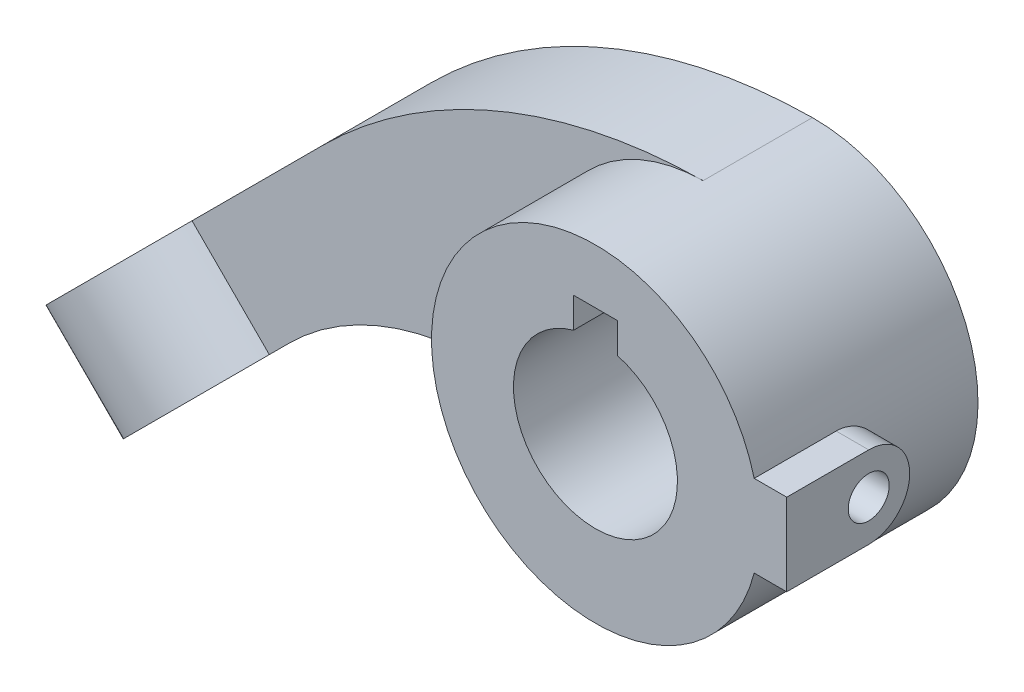
ISO-10303-21;
HEADER;
FILE_DESCRIPTION(('STEP AP214'),'2;1');
FILE_NAME('part.step','',(''),(''),'','','');
FILE_SCHEMA(('AUTOMOTIVE_DESIGN { 1 0 10303 214 1 1 1 1 }'));
ENDSEC;
DATA;
#1=APPLICATION_CONTEXT('core data for automotive mechanical design processes');
#2=APPLICATION_PROTOCOL_DEFINITION('international standard','automotive_design',2000,#1);
#3=PRODUCT_CONTEXT('',#1,'mechanical');
#4=PRODUCT('Part','Part','',(#3));
#5=PRODUCT_RELATED_PRODUCT_CATEGORY('part','',(#4));
#6=PRODUCT_DEFINITION_FORMATION('','',#4);
#7=PRODUCT_DEFINITION_CONTEXT('part definition',#1,'design');
#8=PRODUCT_DEFINITION('design','',#6,#7);
#9=PRODUCT_DEFINITION_SHAPE('','',#8);
#10=(LENGTH_UNIT() NAMED_UNIT(*) SI_UNIT(.MILLI.,.METRE.));
#11=(NAMED_UNIT(*) PLANE_ANGLE_UNIT() SI_UNIT($,.RADIAN.));
#12=(NAMED_UNIT(*) SI_UNIT($,.STERADIAN.) SOLID_ANGLE_UNIT());
#13=UNCERTAINTY_MEASURE_WITH_UNIT(LENGTH_MEASURE(1.E-05),#10,'distance_accuracy_value','');
#14=(GEOMETRIC_REPRESENTATION_CONTEXT(3) GLOBAL_UNCERTAINTY_ASSIGNED_CONTEXT((#13)) GLOBAL_UNIT_ASSIGNED_CONTEXT((#10,
#11,#12)) REPRESENTATION_CONTEXT('',''));
#15=CARTESIAN_POINT('',(0.,0.,0.));
#16=DIRECTION('',(0.,0.,1.));
#17=DIRECTION('',(1.,0.,0.));
#18=AXIS2_PLACEMENT_3D('',#15,#16,#17);
#19=CARTESIAN_POINT('',(0.,0.,40.));
#20=DIRECTION('',(0.,0.,-1.));
#21=DIRECTION('',(-1.,0.,0.));
#22=AXIS2_PLACEMENT_3D('',#19,#20,#21);
#23=CYLINDRICAL_SURFACE('',#22,15.);
#24=CARTESIAN_POINT('',(15.,0.,21.25));
#25=CARTESIAN_POINT('',(14.9999964967003,0.207190221674325,21.2500058143454));
#26=CARTESIAN_POINT('',(14.9956644532957,0.414445394576905,21.2672288769345));
#27=CARTESIAN_POINT('',(14.9788028457474,0.823015809426329,21.3355628782675));
#28=CARTESIAN_POINT('',(14.9662686354994,1.02432761717685,21.3866930238446));
#29=CARTESIAN_POINT('',(14.9343906583008,1.41505218045644,21.5210981336552));
#30=CARTESIAN_POINT('',(14.9150550710515,1.604478908575,21.6043344967882));
#31=CARTESIAN_POINT('',(14.8716335951905,1.96668032976107,21.8004534751121));
#32=CARTESIAN_POINT('',(14.8475475463539,2.13945446087191,21.9133370902974));
#33=CARTESIAN_POINT('',(14.7966853397923,2.46700481825229,22.1680019741355));
#34=CARTESIAN_POINT('',(14.7698676787032,2.62138922515264,22.3102789373977));
#35=CARTESIAN_POINT('',(14.7168405029484,2.90437231800829,22.6186305122726));
#36=CARTESIAN_POINT('',(14.6906310572467,3.03296809237297,22.7847078073673));
#37=CARTESIAN_POINT('',(14.6413693924542,3.26256635699743,23.1389880668425));
#38=CARTESIAN_POINT('',(14.6183698616203,3.36313053981285,23.3274830770218));
#39=CARTESIAN_POINT('',(14.5787373704504,3.53099227137686,23.7193710291501));
#40=CARTESIAN_POINT('',(14.5621033923605,3.59829513860035,23.92276158333));
#41=CARTESIAN_POINT('',(14.5375119174081,3.69638709201191,24.3343587455042));
#42=CARTESIAN_POINT('',(14.5293872749253,3.72788067083013,24.542387240095));
#43=CARTESIAN_POINT('',(14.5222340614898,3.75565443766602,24.9609214224984));
#44=CARTESIAN_POINT('',(14.5232040106982,3.75194035454527,25.1714267017303));
#45=CARTESIAN_POINT('',(14.5339801379204,3.70996631159926,25.5835395193634));
#46=CARTESIAN_POINT('',(14.5435715751823,3.67254585047658,25.7852390536633));
#47=CARTESIAN_POINT('',(14.5701677417767,3.56556046725748,26.1794026272776));
#48=CARTESIAN_POINT('',(14.587172999231,3.49599325517348,26.3718660075723));
#49=CARTESIAN_POINT('',(14.6268778476415,3.32597369484296,26.7443450406303));
#50=CARTESIAN_POINT('',(14.6496331867454,3.22521666808229,26.9242154294739));
#51=CARTESIAN_POINT('',(14.6982427711498,2.99589069003736,27.264796774392));
#52=CARTESIAN_POINT('',(14.7240975583657,2.86731687202209,27.4255043701681));
#53=CARTESIAN_POINT('',(14.7768970134973,2.58165856170305,27.728009039236));
#54=CARTESIAN_POINT('',(14.80385173695,2.42386564541465,27.8691362251534));
#55=CARTESIAN_POINT('',(14.8551491394689,2.08652979375924,28.1230531061598));
#56=CARTESIAN_POINT('',(14.8794917387352,1.90698619426985,28.2358419356589));
#57=CARTESIAN_POINT('',(14.9229433023548,1.53028972170348,28.430126465561));
#58=CARTESIAN_POINT('',(14.9420340031932,1.33307848302155,28.5115133506361));
#59=CARTESIAN_POINT('',(14.9726979247854,0.927190020357202,28.6397932642739));
#60=CARTESIAN_POINT('',(14.984272583482,0.718514997876207,28.6866928910453));
#61=CARTESIAN_POINT('',(14.9983874817844,0.301349925975062,28.7436439138971));
#62=CARTESIAN_POINT('',(15.0011513377069,0.0929917999705201,28.7546075651883));
#63=CARTESIAN_POINT('',(14.9979701203613,-0.322582187003776,28.7418774948613));
#64=CARTESIAN_POINT('',(14.9920258310463,-0.529798149111495,28.7181868930022));
#65=CARTESIAN_POINT('',(14.9722395281838,-0.934035671941231,28.6375727290216));
#66=CARTESIAN_POINT('',(14.9585158546447,-1.13116279742188,28.5811468413076));
#67=CARTESIAN_POINT('',(14.924717665854,-1.51314323113129,28.4372322899289));
#68=CARTESIAN_POINT('',(14.9046425092496,-1.69799529758163,28.3497404892169));
#69=CARTESIAN_POINT('',(14.8598326981554,-2.05380783607458,28.1444096778133));
#70=CARTESIAN_POINT('',(14.8350216841645,-2.22446360458942,28.0260597190086));
#71=CARTESIAN_POINT('',(14.7836127296943,-2.54381653410828,27.7630252280071));
#72=CARTESIAN_POINT('',(14.7570144813255,-2.69250989743314,27.6183361509559));
#73=CARTESIAN_POINT('',(14.7042239239856,-2.9674764201812,27.3024950978907));
#74=CARTESIAN_POINT('',(14.678057604555,-3.09310966905272,27.130780742501));
#75=CARTESIAN_POINT('',(14.629821959558,-3.31377689753411,26.7681684138287));
#76=CARTESIAN_POINT('',(14.6077524521502,-3.40881223540368,26.5772712925744));
#77=CARTESIAN_POINT('',(14.5704523678941,-3.5648785515182,26.1827356939839));
#78=CARTESIAN_POINT('',(14.5551813805407,-3.62611099160838,25.9791809292174));
#79=CARTESIAN_POINT('',(14.5331686006952,-3.71336414985793,25.5642259053637));
#80=CARTESIAN_POINT('',(14.5264249429205,-3.73939256869197,25.3528273724535));
#81=CARTESIAN_POINT('',(14.5223725301746,-3.75509647583946,24.9346974403302));
#82=CARTESIAN_POINT('',(14.5247983170337,-3.74579474444337,24.7280064121408));
#83=CARTESIAN_POINT('',(14.5381977237985,-3.6934431957724,24.3192402782958));
#84=CARTESIAN_POINT('',(14.5491711719226,-3.6503940567158,24.1171650799604));
#85=CARTESIAN_POINT('',(14.5782815174391,-3.53232829861052,23.72447885235));
#86=CARTESIAN_POINT('',(14.5963753810072,-3.45750351170189,23.5338067369031));
#87=CARTESIAN_POINT('',(14.6376938930212,-3.27816228401173,23.1675865432122));
#88=CARTESIAN_POINT('',(14.6609192529923,-3.17364172508522,22.9920405670317));
#89=CARTESIAN_POINT('',(14.7106408566155,-2.9346693715931,22.656113427496));
#90=CARTESIAN_POINT('',(14.7372066208013,-2.79950790728071,22.4962473164404));
#91=CARTESIAN_POINT('',(14.7902006811497,-2.50447342797427,22.2011323880112));
#92=CARTESIAN_POINT('',(14.8166289431745,-2.34459455315285,22.0658894247175));
#93=CARTESIAN_POINT('',(14.8669413911936,-2.0011689667565,21.8214717285886));
#94=CARTESIAN_POINT('',(14.8907708341472,-1.81724605579097,21.7128134658211));
#95=CARTESIAN_POINT('',(14.9326231243774,-1.43316514877618,21.5281313426487));
#96=CARTESIAN_POINT('',(14.9506501299944,-1.23301890859185,21.4520840983787));
#97=CARTESIAN_POINT('',(14.9762014891386,-0.86102563310868,21.3460704241759));
#98=CARTESIAN_POINT('',(14.9850646263173,-0.690950427270172,21.3101218923664));
#99=CARTESIAN_POINT('',(14.9969651307987,-0.347265178840709,21.2620851409451));
#100=CARTESIAN_POINT('',(15.0000029362724,-0.173655403106543,21.2499951267367));
#101=CARTESIAN_POINT('',(15.,0.,21.25));
#102=B_SPLINE_CURVE_WITH_KNOTS('',3,(#24,#25,#26,#27,#28,#29,#30,#31,#32,#33,#34,#35,#36,#37,
#38,#39,#40,#41,#42,#43,#44,#45,#46,#47,#48,#49,#50,#51,#52,#53,#54,#55,#56,#57,#58,#59,#60,#61,
#62,#63,#64,#65,#66,#67,#68,#69,#70,#71,#72,#73,#74,#75,#76,#77,#78,#79,#80,#81,#82,#83,#84,#85,
#86,#87,#88,#89,#90,#91,#92,#93,#94,#95,#96,#97,#98,#99,#100,#101),.UNSPECIFIED.,.T.,.F.,(4,2,2,
2,2,2,2,2,2,2,2,2,2,2,2,2,2,2,2,2,2,2,2,2,2,2,2,2,2,2,2,2,2,2,2,2,2,2,4),(0.,0.620934281179724,
1.24222059440975,1.86276225571526,2.48332485042332,3.11536088592847,3.74746823950154,
4.38896618864517,5.03036152923421,5.65890737752674,6.28735095290044,6.90056242525847,
7.51381758673398,8.13326319693,8.75281727098709,9.3900375243085,10.0272772390392,
10.6667057253109,11.3060118422991,11.9289577238149,12.5518475279016,13.165506862934,
13.7792281831403,14.4038396892168,15.0285590752835,15.6686127301949,16.3086379688207,
16.9448063654645,17.5808355814571,18.1985945101388,18.8163410240997,19.430410014185,
20.0445642036213,20.6747394104466,21.3050642444592,21.9468046376885,22.5880840957326,
23.1085560737525,23.6289889012748),.UNSPECIFIED.);
#103=CARTESIAN_POINT('',(15.,0.,21.25));
#104=VERTEX_POINT('',#103);
#105=EDGE_CURVE('E169',#104,#104,#102,.T.);
#106=ORIENTED_EDGE('',*,*,#105,.T.);
#107=EDGE_LOOP('',(#106));
#108=FACE_BOUND('',#107,.T.);
#109=CARTESIAN_POINT('',(0.,0.,0.));
#110=DIRECTION('',(0.,0.,1.));
#111=DIRECTION('',(1.,0.,0.));
#112=AXIS2_PLACEMENT_3D('',#109,#110,#111);
#113=CIRCLE('',#112,15.);
#114=CARTESIAN_POINT('',(-4.,14.456832294801,0.));
#115=VERTEX_POINT('',#114);
#116=CARTESIAN_POINT('',(4.,14.456832294801,0.));
#117=VERTEX_POINT('',#116);
#118=EDGE_CURVE('E226',#115,#117,#113,.T.);
#119=ORIENTED_EDGE('',*,*,#118,.F.);
#120=DIRECTION('',(0.,0.,-1.));
#121=VECTOR('',#120,1.);
#122=CARTESIAN_POINT('',(-4.,14.456832294801,40.));
#123=LINE('',#122,#121);
#124=CARTESIAN_POINT('',(-4.,14.456832294801,40.));
#125=VERTEX_POINT('',#124);
#126=EDGE_CURVE('E64',#125,#115,#123,.T.);
#127=ORIENTED_EDGE('',*,*,#126,.F.);
#128=CARTESIAN_POINT('',(0.,0.,40.));
#129=DIRECTION('',(0.,0.,1.));
#130=DIRECTION('',(1.,0.,0.));
#131=AXIS2_PLACEMENT_3D('',#128,#129,#130);
#132=CIRCLE('',#131,15.);
#133=CARTESIAN_POINT('',(4.,14.456832294801,40.));
#134=VERTEX_POINT('',#133);
#135=EDGE_CURVE('E256',#125,#134,#132,.T.);
#136=ORIENTED_EDGE('',*,*,#135,.T.);
#137=DIRECTION('',(0.,0.,-1.));
#138=VECTOR('',#137,1.);
#139=CARTESIAN_POINT('',(4.,14.456832294801,40.));
#140=LINE('',#139,#138);
#141=EDGE_CURVE('E231',#134,#117,#140,.T.);
#142=ORIENTED_EDGE('',*,*,#141,.T.);
#143=EDGE_LOOP('',(#119,#127,#136,#142));
#144=FACE_BOUND('',#143,.T.);
#145=ADVANCED_FACE('F56',(#108,#144),#23,.F.);
#146=CARTESIAN_POINT('',(-4.,0.,40.));
#147=DIRECTION('',(1.,0.,0.));
#148=DIRECTION('',(0.,0.,-1.));
#149=AXIS2_PLACEMENT_3D('',#146,#147,#148);
#150=PLANE('',#149);
#151=DIRECTION('',(0.,-1.,0.));
#152=VECTOR('',#151,1.);
#153=CARTESIAN_POINT('',(-4.,0.,0.));
#154=LINE('',#153,#152);
#155=CARTESIAN_POINT('',(-4.,20.,0.));
#156=VERTEX_POINT('',#155);
#157=EDGE_CURVE('E236',#156,#115,#154,.T.);
#158=ORIENTED_EDGE('',*,*,#157,.F.);
#159=DIRECTION('',(0.,0.,-1.));
#160=VECTOR('',#159,1.);
#161=CARTESIAN_POINT('',(-4.,20.,40.));
#162=LINE('',#161,#160);
#163=CARTESIAN_POINT('',(-4.,20.,40.));
#164=VERTEX_POINT('',#163);
#165=EDGE_CURVE('E263',#164,#156,#162,.T.);
#166=ORIENTED_EDGE('',*,*,#165,.F.);
#167=DIRECTION('',(0.,-1.,0.));
#168=VECTOR('',#167,1.);
#169=CARTESIAN_POINT('',(-4.,0.,40.));
#170=LINE('',#169,#168);
#171=EDGE_CURVE('E268',#164,#125,#170,.T.);
#172=ORIENTED_EDGE('',*,*,#171,.T.);
#173=ORIENTED_EDGE('',*,*,#126,.T.);
#174=EDGE_LOOP('',(#158,#166,#172,#173));
#175=FACE_BOUND('',#174,.T.);
#176=ADVANCED_FACE('F214',(#175),#150,.T.);
#177=CARTESIAN_POINT('',(0.,20.,40.));
#178=DIRECTION('',(0.,1.,0.));
#179=DIRECTION('',(0.,0.,1.));
#180=AXIS2_PLACEMENT_3D('',#177,#178,#179);
#181=PLANE('',#180);
#182=DIRECTION('',(1.,0.,0.));
#183=VECTOR('',#182,1.);
#184=CARTESIAN_POINT('',(0.,20.,0.));
#185=LINE('',#184,#183);
#186=CARTESIAN_POINT('',(4.,20.,0.));
#187=VERTEX_POINT('',#186);
#188=EDGE_CURVE('E243',#156,#187,#185,.T.);
#189=ORIENTED_EDGE('',*,*,#188,.T.);
#190=DIRECTION('',(0.,0.,-1.));
#191=VECTOR('',#190,1.);
#192=CARTESIAN_POINT('',(4.,20.,40.));
#193=LINE('',#192,#191);
#194=CARTESIAN_POINT('',(4.,20.,40.));
#195=VERTEX_POINT('',#194);
#196=EDGE_CURVE('E259',#195,#187,#193,.T.);
#197=ORIENTED_EDGE('',*,*,#196,.F.);
#198=DIRECTION('',(1.,0.,0.));
#199=VECTOR('',#198,1.);
#200=CARTESIAN_POINT('',(0.,20.,40.));
#201=LINE('',#200,#199);
#202=EDGE_CURVE('E272',#164,#195,#201,.T.);
#203=ORIENTED_EDGE('',*,*,#202,.F.);
#204=ORIENTED_EDGE('',*,*,#165,.T.);
#205=EDGE_LOOP('',(#189,#197,#203,#204));
#206=FACE_BOUND('',#205,.T.);
#207=ADVANCED_FACE('F219',(#206),#181,.F.);
#208=CARTESIAN_POINT('',(4.,0.,40.));
#209=DIRECTION('',(1.,0.,0.));
#210=DIRECTION('',(0.,0.,-1.));
#211=AXIS2_PLACEMENT_3D('',#208,#209,#210);
#212=PLANE('',#211);
#213=DIRECTION('',(0.,-1.,0.));
#214=VECTOR('',#213,1.);
#215=CARTESIAN_POINT('',(4.,0.,0.));
#216=LINE('',#215,#214);
#217=EDGE_CURVE('E247',#187,#117,#216,.T.);
#218=ORIENTED_EDGE('',*,*,#217,.T.);
#219=ORIENTED_EDGE('',*,*,#141,.F.);
#220=DIRECTION('',(0.,-1.,0.));
#221=VECTOR('',#220,1.);
#222=CARTESIAN_POINT('',(4.,0.,40.));
#223=LINE('',#222,#221);
#224=EDGE_CURVE('E276',#195,#134,#223,.T.);
#225=ORIENTED_EDGE('',*,*,#224,.F.);
#226=ORIENTED_EDGE('',*,*,#196,.T.);
#227=EDGE_LOOP('',(#218,#219,#225,#226));
#228=FACE_BOUND('',#227,.T.);
#229=ADVANCED_FACE('F416',(#228),#212,.F.);
#230=CARTESIAN_POINT('',(0.,0.,40.));
#231=DIRECTION('',(0.,0.,-1.));
#232=DIRECTION('',(-1.,0.,0.));
#233=AXIS2_PLACEMENT_3D('',#230,#231,#232);
#234=CYLINDRICAL_SURFACE('',#233,30.);
#235=CARTESIAN_POINT('',(0.,0.,20.));
#236=DIRECTION('',(0.,0.,1.));
#237=DIRECTION('',(1.,0.,0.));
#238=AXIS2_PLACEMENT_3D('',#235,#236,#237);
#239=CIRCLE('',#238,30.);
#240=CARTESIAN_POINT('',(-0.306138389121367,29.998437947445,20.));
#241=VERTEX_POINT('',#240);
#242=CARTESIAN_POINT('',(-15.2362950475446,-25.8428967653428,20.));
#243=VERTEX_POINT('',#242);
#244=EDGE_CURVE('E339',#241,#243,#239,.T.);
#245=ORIENTED_EDGE('',*,*,#244,.T.);
#246=DIRECTION('',(0.,0.,-1.));
#247=VECTOR('',#246,1.);
#248=CARTESIAN_POINT('',(-15.2362950475446,-25.8428967653428,20.));
#249=LINE('',#248,#247);
#250=CARTESIAN_POINT('',(-15.2362950475446,-25.8428967653428,0.));
#251=VERTEX_POINT('',#250);
#252=EDGE_CURVE('E368',#243,#251,#249,.T.);
#253=ORIENTED_EDGE('',*,*,#252,.T.);
#254=CARTESIAN_POINT('',(0.,0.,0.));
#255=DIRECTION('',(0.,0.,1.));
#256=DIRECTION('',(1.,0.,0.));
#257=AXIS2_PLACEMENT_3D('',#254,#255,#256);
#258=CIRCLE('',#257,30.);
#259=CARTESIAN_POINT('',(-0.306138389121368,29.998437947445,0.));
#260=VERTEX_POINT('',#259);
#261=EDGE_CURVE('E253',#251,#260,#258,.T.);
#262=ORIENTED_EDGE('',*,*,#261,.T.);
#263=DIRECTION('',(0.,0.,-1.));
#264=VECTOR('',#263,1.);
#265=CARTESIAN_POINT('',(-0.306138389121368,29.998437947445,20.));
#266=LINE('',#265,#264);
#267=EDGE_CURVE('E364',#241,#260,#266,.T.);
#268=ORIENTED_EDGE('',*,*,#267,.F.);
#269=EDGE_LOOP('',(#245,#253,#262,#268));
#270=FACE_BOUND('',#269,.T.);
#271=CARTESIAN_POINT('',(0.,0.,40.));
#272=DIRECTION('',(0.,0.,1.));
#273=DIRECTION('',(1.,0.,0.));
#274=AXIS2_PLACEMENT_3D('',#271,#272,#273);
#275=CIRCLE('',#274,30.);
#276=CARTESIAN_POINT('',(29.0473750965556,7.5,40.));
#277=VERTEX_POINT('',#276);
#278=CARTESIAN_POINT('',(29.0473750965556,-7.5,40.));
#279=VERTEX_POINT('',#278);
#280=EDGE_CURVE('E181',#277,#279,#275,.T.);
#281=ORIENTED_EDGE('',*,*,#280,.F.);
#282=DIRECTION('',(0.,0.,-1.));
#283=VECTOR('',#282,1.);
#284=CARTESIAN_POINT('',(29.0473750965556,7.5,40.));
#285=LINE('',#284,#283);
#286=CARTESIAN_POINT('',(29.0473750965556,7.5,25.));
#287=VERTEX_POINT('',#286);
#288=EDGE_CURVE('E168',#287,#277,#285,.F.);
#289=ORIENTED_EDGE('',*,*,#288,.F.);
#290=CARTESIAN_POINT('',(29.0473750965556,-7.50000000000001,25.));
#291=CARTESIAN_POINT('',(29.0473511759174,-7.50002630108685,24.7925905745089));
#292=CARTESIAN_POINT('',(29.0495957628317,-7.49139743924831,24.5851895061186));
#293=CARTESIAN_POINT('',(29.058447840632,-7.45702283353465,24.1719382617645));
#294=CARTESIAN_POINT('',(29.0650545973684,-7.43127996992728,23.9660878307249));
#295=CARTESIAN_POINT('',(29.0824398226746,-7.36293825789864,23.5578049265756));
#296=CARTESIAN_POINT('',(29.0932100239986,-7.32037280993147,23.3553665044896));
#297=CARTESIAN_POINT('',(29.1185927891341,-7.21874728965258,22.9549198576045));
#298=CARTESIAN_POINT('',(29.1332054057858,-7.15968699050624,22.75691169377));
#299=CARTESIAN_POINT('',(29.1658394705169,-7.0255647350585,22.3667542852176));
#300=CARTESIAN_POINT('',(29.1838598476376,-6.95050780508764,22.1746032217567));
#301=CARTESIAN_POINT('',(29.2227994435593,-6.78492631419789,21.7973083945893));
#302=CARTESIAN_POINT('',(29.2437197368126,-6.69439601730774,21.6121672606625));
#303=CARTESIAN_POINT('',(29.2878606028261,-6.49856054845433,21.2501932797977));
#304=CARTESIAN_POINT('',(29.311080878195,-6.3932572859271,21.0733593630716));
#305=CARTESIAN_POINT('',(29.3591908844649,-6.16855831917554,20.7290319178891));
#306=CARTESIAN_POINT('',(29.3840812399093,-6.04915733014004,20.5615419270544));
#307=CARTESIAN_POINT('',(29.4353394276645,-5.79464941853499,20.2338800020483));
#308=CARTESIAN_POINT('',(29.4617265274239,-5.65928334041232,20.0739123247392));
#309=CARTESIAN_POINT('',(29.5148010113881,-5.37562488146013,19.7658317463563));
#310=CARTESIAN_POINT('',(29.5414884969906,-5.22732801437878,19.6177229941198));
#311=CARTESIAN_POINT('',(29.5944200556253,-4.91882000718369,19.3343957462764));
#312=CARTESIAN_POINT('',(29.6206641312248,-4.75860893607982,19.1991771760169));
#313=CARTESIAN_POINT('',(29.6719897661141,-4.42731474168454,18.9425427553436));
#314=CARTESIAN_POINT('',(29.6970713323942,-4.25623168378125,18.8211268219278));
#315=CARTESIAN_POINT('',(29.7457275538512,-3.90181138427035,18.5913260746709));
#316=CARTESIAN_POINT('',(29.7692758006224,-3.71833478777787,18.4831504346699));
#317=CARTESIAN_POINT('',(29.8137942642765,-3.34266809082169,18.2827179974889));
#318=CARTESIAN_POINT('',(29.8347654160678,-3.15048118508953,18.1904554224995));
#319=CARTESIAN_POINT('',(29.8735452916281,-2.75863317318168,18.0225083657783));
#320=CARTESIAN_POINT('',(29.8913533209924,-2.55897043744582,17.946827523409));
#321=CARTESIAN_POINT('',(29.9232806602041,-2.1537317289005,17.8127217006889));
#322=CARTESIAN_POINT('',(29.9374014885824,-1.94815822921592,17.7542896153402));
#323=CARTESIAN_POINT('',(29.9613124992079,-1.53667744877526,17.6561271734078));
#324=CARTESIAN_POINT('',(29.9711831556396,-1.33085796275945,17.6160482861094));
#325=CARTESIAN_POINT('',(29.986713323254,-0.916507124624956,17.5532622433413));
#326=CARTESIAN_POINT('',(29.9923744538182,-0.707976846777572,17.5305484075366));
#327=CARTESIAN_POINT('',(29.9993310272642,-0.289657091019968,17.5026641440293));
#328=CARTESIAN_POINT('',(30.0006261214674,-0.0798675138803536,17.4974951174824));
#329=CARTESIAN_POINT('',(29.9988126242559,0.339386681265645,17.5047500571515));
#330=CARTESIAN_POINT('',(29.9957040875121,0.548851303274017,17.5171738049536));
#331=CARTESIAN_POINT('',(29.9852905046834,0.961217992261124,17.5590293371298));
#332=CARTESIAN_POINT('',(29.9780810549947,1.16416193681367,17.5880737665741));
#333=CARTESIAN_POINT('',(29.9597313457171,1.56688998921898,17.6626430175519));
#334=CARTESIAN_POINT('',(29.9485897339773,1.76667298539533,17.7081735082806));
#335=CARTESIAN_POINT('',(29.9226804741066,2.16155863824409,17.815328423623));
#336=CARTESIAN_POINT('',(29.9079140483149,2.3566628483751,17.8769474234065));
#337=CARTESIAN_POINT('',(29.8751407694803,2.74101865026757,18.0158330296672));
#338=CARTESIAN_POINT('',(29.857132704997,2.9302680229131,18.0931054873931));
#339=CARTESIAN_POINT('',(29.8181867181723,3.30321049470373,18.2634437498359));
#340=CARTESIAN_POINT('',(29.7972247235465,3.48684111402383,18.3566408072565));
#341=CARTESIAN_POINT('',(29.7530411354479,3.84567797098895,18.5577119457031));
#342=CARTESIAN_POINT('',(29.7298187644511,4.02088127862292,18.6655910821877));
#343=CARTESIAN_POINT('',(29.6817351267761,4.36167586629251,18.8952475428427));
#344=CARTESIAN_POINT('',(29.6568739414194,4.5272676225082,19.0170241776084));
#345=CARTESIAN_POINT('',(29.6061655119558,4.84781396384561,19.2736698972185));
#346=CARTESIAN_POINT('',(29.580318248315,5.00276833807404,19.4085392415068));
#347=CARTESIAN_POINT('',(29.5276114452926,5.30512497019636,19.6943342324173));
#348=CARTESIAN_POINT('',(29.5007434803989,5.45220775675252,19.8455965078035));
#349=CARTESIAN_POINT('',(29.4474448513581,5.73309923074355,20.1599596557595));
#350=CARTESIAN_POINT('',(29.4210140453778,5.86691229674457,20.323056592317));
#351=CARTESIAN_POINT('',(29.3693097764637,6.1204904647594,20.6601715323998));
#352=CARTESIAN_POINT('',(29.3440370732009,6.24024642404371,20.8341965318355));
#353=CARTESIAN_POINT('',(29.2954027236369,6.46471718527408,21.1918521457009));
#354=CARTESIAN_POINT('',(29.2720403434714,6.56943777496164,21.375479026631));
#355=CARTESIAN_POINT('',(29.2277713463454,6.76368011488973,21.7522601497587));
#356=CARTESIAN_POINT('',(29.2068797977731,6.85310995400144,21.9454635793328));
#357=CARTESIAN_POINT('',(29.1683513607566,7.01528530975907,22.3389775838536));
#358=CARTESIAN_POINT('',(29.1507131740993,7.08803748424312,22.5392852857213));
#359=CARTESIAN_POINT('',(29.1192433218482,7.21623355454386,22.9454262300561));
#360=CARTESIAN_POINT('',(29.1054077164659,7.27169537266329,23.1512535091761));
#361=CARTESIAN_POINT('',(29.0819591937685,7.364913936369,23.5670292649706));
#362=CARTESIAN_POINT('',(29.072344298296,7.40267897662101,23.7769757627509));
#363=CARTESIAN_POINT('',(29.0591545349784,7.45426794156711,24.1558862095667));
#364=CARTESIAN_POINT('',(29.0547430946303,7.47142252804004,24.3243757189075));
#365=CARTESIAN_POINT('',(29.0488508241981,7.49428407329826,24.6619054436126));
#366=CARTESIAN_POINT('',(29.0473652527177,7.50000955325582,24.8309443226238));
#367=CARTESIAN_POINT('',(29.0473750965556,7.5,25.));
#368=B_SPLINE_CURVE_WITH_KNOTS('',3,(#290,#291,#292,#293,#294,#295,#296,#297,#298,#299,#300,
#301,#302,#303,#304,#305,#306,#307,#308,#309,#310,#311,#312,#313,#314,#315,#316,#317,#318,#319,
#320,#321,#322,#323,#324,#325,#326,#327,#328,#329,#330,#331,#332,#333,#334,#335,#336,#337,#338,
#339,#340,#341,#342,#343,#344,#345,#346,#347,#348,#349,#350,#351,#352,#353,#354,#355,#356,#357,
#358,#359,#360,#361,#362,#363,#364,#365,#366,#367),.UNSPECIFIED.,.F.,.F.,(4,2,2,2,2,2,2,2,2,2,2,
2,2,2,2,2,2,2,2,2,2,2,2,2,2,2,2,2,2,2,2,2,2,2,2,2,2,2,4),(0.,0.622023977548273,1.24394329563489,
1.8646339757276,2.48533319188245,3.10583766378365,3.72657265732951,4.34722749339996,
4.9681157373419,5.60101548914207,6.23413570173872,6.86725224744074,7.5003649857086,
8.14245446215661,8.78431031193528,9.42630689558009,10.0680386618956,10.6970193222736,
11.3257578918752,11.954546672337,12.583327646473,13.1980188731611,13.8129216797584,
14.4276174165124,15.042543351383,15.662806347413,16.2832834605873,16.9037298075039,
17.5241884516385,18.1615007474758,18.798602046807,19.4361154468078,20.0733827795184,
20.7143553882398,21.3550716689593,21.9951215904936,22.6348712130939,23.1427263018255,
23.6497577275344),.UNSPECIFIED.);
#369=CARTESIAN_POINT('',(29.0473750965556,-7.5,25.));
#370=VERTEX_POINT('',#369);
#371=EDGE_CURVE('E157',#370,#287,#368,.T.);
#372=ORIENTED_EDGE('',*,*,#371,.F.);
#373=DIRECTION('',(0.,0.,-1.));
#374=VECTOR('',#373,1.);
#375=CARTESIAN_POINT('',(29.0473750965556,-7.5,40.));
#376=LINE('',#375,#374);
#377=EDGE_CURVE('E178',#279,#370,#376,.T.);
#378=ORIENTED_EDGE('',*,*,#377,.F.);
#379=EDGE_LOOP('',(#281,#289,#372,#378));
#380=FACE_BOUND('',#379,.T.);
#381=ADVANCED_FACE('F180',(#270,#380),#234,.T.);
#382=CARTESIAN_POINT('',(0.,0.,40.));
#383=DIRECTION('',(0.,0.,1.));
#384=DIRECTION('',(1.,0.,0.));
#385=AXIS2_PLACEMENT_3D('',#382,#383,#384);
#386=PLANE('',#385);
#387=ORIENTED_EDGE('',*,*,#135,.F.);
#388=ORIENTED_EDGE('',*,*,#171,.F.);
#389=ORIENTED_EDGE('',*,*,#202,.T.);
#390=ORIENTED_EDGE('',*,*,#224,.T.);
#391=EDGE_LOOP('',(#387,#388,#389,#390));
#392=FACE_BOUND('',#391,.T.);
#393=ORIENTED_EDGE('',*,*,#280,.T.);
#394=DIRECTION('',(1.,0.,0.));
#395=VECTOR('',#394,1.);
#396=CARTESIAN_POINT('',(-120.210152801713,-7.5,40.));
#397=LINE('',#396,#395);
#398=CARTESIAN_POINT('',(35.,-7.5,40.));
#399=VERTEX_POINT('',#398);
#400=EDGE_CURVE('E284',#279,#399,#397,.T.);
#401=ORIENTED_EDGE('',*,*,#400,.T.);
#402=DIRECTION('',(0.,-1.,0.));
#403=VECTOR('',#402,1.);
#404=CARTESIAN_POINT('',(35.,7.5,40.));
#405=LINE('',#404,#403);
#406=CARTESIAN_POINT('',(35.,7.5,40.));
#407=VERTEX_POINT('',#406);
#408=EDGE_CURVE('E287',#407,#399,#405,.T.);
#409=ORIENTED_EDGE('',*,*,#408,.F.);
#410=DIRECTION('',(1.,0.,0.));
#411=VECTOR('',#410,1.);
#412=CARTESIAN_POINT('',(-120.210152801713,7.5,40.));
#413=LINE('',#412,#411);
#414=EDGE_CURVE('E71',#277,#407,#413,.T.);
#415=ORIENTED_EDGE('',*,*,#414,.F.);
#416=EDGE_LOOP('',(#393,#401,#409,#415));
#417=FACE_BOUND('',#416,.T.);
#418=ADVANCED_FACE('F283',(#392,#417),#386,.T.);
#419=CARTESIAN_POINT('',(0.,0.,0.));
#420=DIRECTION('',(0.,0.,1.));
#421=DIRECTION('',(1.,0.,0.));
#422=AXIS2_PLACEMENT_3D('',#419,#420,#421);
#423=PLANE('',#422);
#424=ORIENTED_EDGE('',*,*,#118,.T.);
#425=ORIENTED_EDGE('',*,*,#217,.F.);
#426=ORIENTED_EDGE('',*,*,#188,.F.);
#427=ORIENTED_EDGE('',*,*,#157,.T.);
#428=EDGE_LOOP('',(#424,#425,#426,#427));
#429=FACE_BOUND('',#428,.T.);
#430=DIRECTION('',(0.70710678118655,0.707106781186545,0.));
#431=VECTOR('',#430,1.);
#432=CARTESIAN_POINT('',(-21.2132034355961,21.2132034355963,0.));
#433=LINE('',#432,#431);
#434=CARTESIAN_POINT('',(-79.6764328403353,-37.2500259691425,0.));
#435=VERTEX_POINT('',#434);
#436=CARTESIAN_POINT('',(-75.985459186113,-33.5590523149202,0.));
#437=VERTEX_POINT('',#436);
#438=EDGE_CURVE('E330',#435,#437,#433,.T.);
#439=ORIENTED_EDGE('',*,*,#438,.F.);
#440=DIRECTION('',(0.707106781186545,-0.70710678118655,0.));
#441=VECTOR('',#440,1.);
#442=CARTESIAN_POINT('',(-93.8185684640662,-23.1078903454115,0.));
#443=LINE('',#442,#441);
#444=CARTESIAN_POINT('',(-93.8185684640662,-23.1078903454115,0.));
#445=VERTEX_POINT('',#444);
#446=EDGE_CURVE('E323',#435,#445,#443,.F.);
#447=ORIENTED_EDGE('',*,*,#446,.T.);
#448=DIRECTION('',(0.707106781186548,0.707106781186547,0.));
#449=VECTOR('',#448,1.);
#450=CARTESIAN_POINT('',(-35.3553390593273,35.3553390593274,0.));
#451=LINE('',#450,#449);
#452=CARTESIAN_POINT('',(-69.9963552107049,0.714322907949781,0.));
#453=VERTEX_POINT('',#452);
#454=EDGE_CURVE('E335',#445,#453,#451,.T.);
#455=ORIENTED_EDGE('',*,*,#454,.T.);
#456=CARTESIAN_POINT('',(0.714322907949858,-69.9963552107049,0.));
#457=DIRECTION('',(0.,0.,1.));
#458=DIRECTION('',(1.,0.,0.));
#459=AXIS2_PLACEMENT_3D('',#456,#457,#458);
#460=CIRCLE('',#459,100.);
#461=EDGE_CURVE('E355',#453,#260,#460,.F.);
#462=ORIENTED_EDGE('',*,*,#461,.T.);
#463=ORIENTED_EDGE('',*,*,#261,.F.);
#464=CARTESIAN_POINT('',(-40.6301201267856,-68.9143913742476,0.));
#465=DIRECTION('',(0.,0.,1.));
#466=DIRECTION('',(1.,0.,0.));
#467=AXIS2_PLACEMENT_3D('',#464,#465,#466);
#468=CIRCLE('',#467,50.);
#469=EDGE_CURVE('E351',#437,#251,#468,.F.);
#470=ORIENTED_EDGE('',*,*,#469,.F.);
#471=EDGE_LOOP('',(#439,#447,#455,#462,#463,#470));
#472=FACE_BOUND('',#471,.T.);
#473=ADVANCED_FACE('F241',(#429,#472),#423,.F.);
#474=CARTESIAN_POINT('',(-21.2132034355961,21.2132034355963,20.));
#475=DIRECTION('',(-0.707106781186545,0.70710678118655,0.));
#476=DIRECTION('',(-0.70710678118655,-0.707106781186545,0.));
#477=AXIS2_PLACEMENT_3D('',#474,#475,#476);
#478=PLANE('',#477);
#479=CARTESIAN_POINT('',(-91.9238815542512,-49.4974746830583,10.));
#480=DIRECTION('',(0.707106781186545,-0.70710678118655,0.));
#481=DIRECTION('',(0.70710678118655,0.707106781186545,0.));
#482=AXIS2_PLACEMENT_3D('',#479,#480,#481);
#483=CIRCLE('',#482,20.);
#484=CARTESIAN_POINT('',(-79.6764328403353,-37.2500259691425,20.));
#485=VERTEX_POINT('',#484);
#486=EDGE_CURVE('E315',#485,#435,#483,.T.);
#487=ORIENTED_EDGE('',*,*,#486,.T.);
#488=ORIENTED_EDGE('',*,*,#438,.T.);
#489=DIRECTION('',(0.,0.,-1.));
#490=VECTOR('',#489,1.);
#491=CARTESIAN_POINT('',(-75.985459186113,-33.5590523149202,20.));
#492=LINE('',#491,#490);
#493=CARTESIAN_POINT('',(-75.985459186113,-33.5590523149202,20.));
#494=VERTEX_POINT('',#493);
#495=EDGE_CURVE('E237',#494,#437,#492,.T.);
#496=ORIENTED_EDGE('',*,*,#495,.F.);
#497=DIRECTION('',(0.70710678118655,0.707106781186545,0.));
#498=VECTOR('',#497,1.);
#499=CARTESIAN_POINT('',(-21.2132034355961,21.2132034355963,20.));
#500=LINE('',#499,#498);
#501=EDGE_CURVE('E331',#485,#494,#500,.T.);
#502=ORIENTED_EDGE('',*,*,#501,.F.);
#503=EDGE_LOOP('',(#487,#488,#496,#502));
#504=FACE_BOUND('',#503,.T.);
#505=CARTESIAN_POINT('',(-91.9238815542512,-49.4974746830583,10.));
#506=DIRECTION('',(0.707106781186545,-0.70710678118655,0.));
#507=DIRECTION('',(0.70710678118655,0.707106781186545,0.));
#508=AXIS2_PLACEMENT_3D('',#505,#506,#507);
#509=CIRCLE('',#508,10.);
#510=CARTESIAN_POINT('',(-84.8528137423857,-42.4264068711929,10.));
#511=VERTEX_POINT('',#510);
#512=EDGE_CURVE('E316',#511,#511,#509,.T.);
#513=ORIENTED_EDGE('',*,*,#512,.F.);
#514=EDGE_LOOP('',(#513));
#515=FACE_BOUND('',#514,.T.);
#516=ADVANCED_FACE('F381',(#504,#515),#478,.F.);
#517=CARTESIAN_POINT('',(-40.6301201267856,-68.9143913742476,20.));
#518=DIRECTION('',(0.,0.,-1.));
#519=DIRECTION('',(-1.,0.,0.));
#520=AXIS2_PLACEMENT_3D('',#517,#518,#519);
#521=CYLINDRICAL_SURFACE('',#520,50.);
#522=ORIENTED_EDGE('',*,*,#469,.T.);
#523=ORIENTED_EDGE('',*,*,#252,.F.);
#524=CARTESIAN_POINT('',(-40.6301201267856,-68.9143913742476,20.));
#525=DIRECTION('',(0.,0.,1.));
#526=DIRECTION('',(1.,0.,0.));
#527=AXIS2_PLACEMENT_3D('',#524,#525,#526);
#528=CIRCLE('',#527,50.);
#529=EDGE_CURVE('E334',#494,#243,#528,.F.);
#530=ORIENTED_EDGE('',*,*,#529,.F.);
#531=ORIENTED_EDGE('',*,*,#495,.T.);
#532=EDGE_LOOP('',(#522,#523,#530,#531));
#533=FACE_BOUND('',#532,.T.);
#534=ADVANCED_FACE('F376',(#533),#521,.F.);
#535=CARTESIAN_POINT('',(0.714322907949858,-69.9963552107049,20.));
#536=DIRECTION('',(0.,0.,-1.));
#537=DIRECTION('',(-1.,0.,0.));
#538=AXIS2_PLACEMENT_3D('',#535,#536,#537);
#539=CYLINDRICAL_SURFACE('',#538,100.);
#540=ORIENTED_EDGE('',*,*,#461,.F.);
#541=DIRECTION('',(0.,0.,-1.));
#542=VECTOR('',#541,1.);
#543=CARTESIAN_POINT('',(-69.9963552107049,0.714322907949781,20.));
#544=LINE('',#543,#542);
#545=CARTESIAN_POINT('',(-69.9963552107049,0.714322907949781,20.));
#546=VERTEX_POINT('',#545);
#547=EDGE_CURVE('E348',#546,#453,#544,.T.);
#548=ORIENTED_EDGE('',*,*,#547,.F.);
#549=CARTESIAN_POINT('',(0.714322907949858,-69.9963552107049,20.));
#550=DIRECTION('',(0.,0.,1.));
#551=DIRECTION('',(1.,0.,0.));
#552=AXIS2_PLACEMENT_3D('',#549,#550,#551);
#553=CIRCLE('',#552,100.);
#554=EDGE_CURVE('E342',#546,#241,#553,.F.);
#555=ORIENTED_EDGE('',*,*,#554,.T.);
#556=ORIENTED_EDGE('',*,*,#267,.T.);
#557=EDGE_LOOP('',(#540,#548,#555,#556));
#558=FACE_BOUND('',#557,.T.);
#559=ADVANCED_FACE('F396',(#558),#539,.T.);
#560=CARTESIAN_POINT('',(-35.3553390593273,35.3553390593274,20.));
#561=DIRECTION('',(-0.707106781186547,0.707106781186548,0.));
#562=DIRECTION('',(-0.707106781186548,-0.707106781186547,0.));
#563=AXIS2_PLACEMENT_3D('',#560,#561,#562);
#564=PLANE('',#563);
#565=CARTESIAN_POINT('',(-106.066017177982,-35.3553390593273,10.));
#566=DIRECTION('',(0.707106781186545,-0.70710678118655,0.));
#567=DIRECTION('',(0.70710678118655,0.707106781186545,0.));
#568=AXIS2_PLACEMENT_3D('',#565,#566,#567);
#569=CIRCLE('',#568,10.);
#570=CARTESIAN_POINT('',(-98.9949493661166,-28.2842712474619,10.));
#571=VERTEX_POINT('',#570);
#572=EDGE_CURVE('E311',#571,#571,#569,.T.);
#573=ORIENTED_EDGE('',*,*,#572,.T.);
#574=EDGE_LOOP('',(#573));
#575=FACE_BOUND('',#574,.T.);
#576=ORIENTED_EDGE('',*,*,#454,.F.);
#577=CARTESIAN_POINT('',(-106.066017177982,-35.3553390593273,10.));
#578=DIRECTION('',(0.707106781186545,-0.70710678118655,0.));
#579=DIRECTION('',(0.70710678118655,0.707106781186545,0.));
#580=AXIS2_PLACEMENT_3D('',#577,#578,#579);
#581=CIRCLE('',#580,20.);
#582=CARTESIAN_POINT('',(-93.8185684640662,-23.1078903454114,20.));
#583=VERTEX_POINT('',#582);
#584=EDGE_CURVE('E320',#583,#445,#581,.T.);
#585=ORIENTED_EDGE('',*,*,#584,.F.);
#586=DIRECTION('',(0.707106781186548,0.707106781186547,0.));
#587=VECTOR('',#586,1.);
#588=CARTESIAN_POINT('',(-35.3553390593273,35.3553390593274,20.));
#589=LINE('',#588,#587);
#590=EDGE_CURVE('E79',#583,#546,#589,.T.);
#591=ORIENTED_EDGE('',*,*,#590,.T.);
#592=ORIENTED_EDGE('',*,*,#547,.T.);
#593=EDGE_LOOP('',(#576,#585,#591,#592));
#594=FACE_BOUND('',#593,.T.);
#595=ADVANCED_FACE('F393',(#575,#594),#564,.T.);
#596=CARTESIAN_POINT('',(0.,0.,20.));
#597=DIRECTION('',(0.,0.,1.));
#598=DIRECTION('',(1.,0.,0.));
#599=AXIS2_PLACEMENT_3D('',#596,#597,#598);
#600=PLANE('',#599);
#601=DIRECTION('',(0.707106781186545,-0.70710678118655,0.));
#602=VECTOR('',#601,1.);
#603=CARTESIAN_POINT('',(-93.8185684640662,-23.1078903454115,20.));
#604=LINE('',#603,#602);
#605=EDGE_CURVE('E12',#485,#583,#604,.F.);
#606=ORIENTED_EDGE('',*,*,#605,.F.);
#607=ORIENTED_EDGE('',*,*,#501,.T.);
#608=ORIENTED_EDGE('',*,*,#529,.T.);
#609=ORIENTED_EDGE('',*,*,#244,.F.);
#610=ORIENTED_EDGE('',*,*,#554,.F.);
#611=ORIENTED_EDGE('',*,*,#590,.F.);
#612=EDGE_LOOP('',(#606,#607,#608,#609,#610,#611));
#613=FACE_BOUND('',#612,.T.);
#614=ADVANCED_FACE('F388',(#613),#600,.T.);
#615=CARTESIAN_POINT('',(-106.066017177982,-35.3553390593273,10.));
#616=DIRECTION('',(0.707106781186545,-0.70710678118655,0.));
#617=DIRECTION('',(0.70710678118655,0.707106781186545,0.));
#618=AXIS2_PLACEMENT_3D('',#615,#616,#617);
#619=CYLINDRICAL_SURFACE('',#618,20.);
#620=ORIENTED_EDGE('',*,*,#446,.F.);
#621=ORIENTED_EDGE('',*,*,#486,.F.);
#622=ORIENTED_EDGE('',*,*,#605,.T.);
#623=ORIENTED_EDGE('',*,*,#584,.T.);
#624=EDGE_LOOP('',(#620,#621,#622,#623));
#625=FACE_BOUND('',#624,.T.);
#626=ADVANCED_FACE('F209',(#625),#619,.T.);
#627=CARTESIAN_POINT('',(-106.066017177982,-35.3553390593273,10.));
#628=DIRECTION('',(0.707106781186545,-0.70710678118655,0.));
#629=DIRECTION('',(0.70710678118655,0.707106781186545,0.));
#630=AXIS2_PLACEMENT_3D('',#627,#628,#629);
#631=CYLINDRICAL_SURFACE('',#630,10.);
#632=ORIENTED_EDGE('',*,*,#512,.T.);
#633=EDGE_LOOP('',(#632));
#634=FACE_BOUND('',#633,.T.);
#635=ORIENTED_EDGE('',*,*,#572,.F.);
#636=EDGE_LOOP('',(#635));
#637=FACE_BOUND('',#636,.T.);
#638=ADVANCED_FACE('F203',(#634,#637),#631,.F.);
#639=CARTESIAN_POINT('',(-120.210152801713,7.5,25.));
#640=DIRECTION('',(0.,1.,0.));
#641=DIRECTION('',(0.,0.,1.));
#642=AXIS2_PLACEMENT_3D('',#639,#640,#641);
#643=PLANE('',#642);
#644=DIRECTION('',(1.,0.,0.));
#645=VECTOR('',#644,1.);
#646=CARTESIAN_POINT('',(-120.210152801713,7.5,25.));
#647=LINE('',#646,#645);
#648=CARTESIAN_POINT('',(35.,7.5,25.));
#649=VERTEX_POINT('',#648);
#650=EDGE_CURVE('E161',#287,#649,#647,.T.);
#651=ORIENTED_EDGE('',*,*,#650,.F.);
#652=ORIENTED_EDGE('',*,*,#288,.T.);
#653=ORIENTED_EDGE('',*,*,#414,.T.);
#654=DIRECTION('',(0.,0.,1.));
#655=VECTOR('',#654,1.);
#656=CARTESIAN_POINT('',(35.,7.5,25.));
#657=LINE('',#656,#655);
#658=EDGE_CURVE('E175',#649,#407,#657,.T.);
#659=ORIENTED_EDGE('',*,*,#658,.F.);
#660=EDGE_LOOP('',(#651,#652,#653,#659));
#661=FACE_BOUND('',#660,.T.);
#662=ADVANCED_FACE('F172',(#661),#643,.T.);
#663=CARTESIAN_POINT('',(35.,0.,25.));
#664=DIRECTION('',(1.,0.,0.));
#665=DIRECTION('',(0.,0.,-1.));
#666=AXIS2_PLACEMENT_3D('',#663,#664,#665);
#667=PLANE('',#666);
#668=CARTESIAN_POINT('',(35.,0.,25.));
#669=DIRECTION('',(1.,0.,0.));
#670=DIRECTION('',(0.,0.,-1.));
#671=AXIS2_PLACEMENT_3D('',#668,#669,#670);
#672=CIRCLE('',#671,3.75);
#673=CARTESIAN_POINT('',(35.,0.,21.25));
#674=VERTEX_POINT('',#673);
#675=EDGE_CURVE('E295',#674,#674,#672,.T.);
#676=ORIENTED_EDGE('',*,*,#675,.F.);
#677=EDGE_LOOP('',(#676));
#678=FACE_BOUND('',#677,.T.);
#679=CARTESIAN_POINT('',(35.,0.,25.));
#680=DIRECTION('',(1.,0.,0.));
#681=DIRECTION('',(0.,0.,-1.));
#682=AXIS2_PLACEMENT_3D('',#679,#680,#681);
#683=CIRCLE('',#682,7.5);
#684=CARTESIAN_POINT('',(35.,-7.5,25.));
#685=VERTEX_POINT('',#684);
#686=EDGE_CURVE('E300',#685,#649,#683,.T.);
#687=ORIENTED_EDGE('',*,*,#686,.T.);
#688=ORIENTED_EDGE('',*,*,#658,.T.);
#689=ORIENTED_EDGE('',*,*,#408,.T.);
#690=DIRECTION('',(0.,0.,-1.));
#691=VECTOR('',#690,1.);
#692=CARTESIAN_POINT('',(35.,-7.5,25.));
#693=LINE('',#692,#691);
#694=EDGE_CURVE('E291',#399,#685,#693,.T.);
#695=ORIENTED_EDGE('',*,*,#694,.T.);
#696=EDGE_LOOP('',(#687,#688,#689,#695));
#697=FACE_BOUND('',#696,.T.);
#698=ADVANCED_FACE('F200',(#678,#697),#667,.T.);
#699=CARTESIAN_POINT('',(-120.210152801713,0.,25.));
#700=DIRECTION('',(1.,0.,0.));
#701=DIRECTION('',(0.,0.,-1.));
#702=AXIS2_PLACEMENT_3D('',#699,#700,#701);
#703=CYLINDRICAL_SURFACE('',#702,7.5);
#704=DIRECTION('',(1.,0.,0.));
#705=VECTOR('',#704,1.);
#706=CARTESIAN_POINT('',(-120.210152801713,-7.5,25.));
#707=LINE('',#706,#705);
#708=EDGE_CURVE('E163',#370,#685,#707,.T.);
#709=ORIENTED_EDGE('',*,*,#708,.F.);
#710=ORIENTED_EDGE('',*,*,#371,.T.);
#711=ORIENTED_EDGE('',*,*,#650,.T.);
#712=ORIENTED_EDGE('',*,*,#686,.F.);
#713=EDGE_LOOP('',(#709,#710,#711,#712));
#714=FACE_BOUND('',#713,.T.);
#715=ADVANCED_FACE('F159',(#714),#703,.T.);
#716=CARTESIAN_POINT('',(-120.210152801713,-7.5,25.));
#717=DIRECTION('',(0.,-1.,0.));
#718=DIRECTION('',(0.,0.,-1.));
#719=AXIS2_PLACEMENT_3D('',#716,#717,#718);
#720=PLANE('',#719);
#721=ORIENTED_EDGE('',*,*,#400,.F.);
#722=ORIENTED_EDGE('',*,*,#377,.T.);
#723=ORIENTED_EDGE('',*,*,#708,.T.);
#724=ORIENTED_EDGE('',*,*,#694,.F.);
#725=EDGE_LOOP('',(#721,#722,#723,#724));
#726=FACE_BOUND('',#725,.T.);
#727=ADVANCED_FACE('F292',(#726),#720,.T.);
#728=CARTESIAN_POINT('',(-120.210152801713,0.,25.));
#729=DIRECTION('',(1.,0.,0.));
#730=DIRECTION('',(0.,0.,-1.));
#731=AXIS2_PLACEMENT_3D('',#728,#729,#730);
#732=CYLINDRICAL_SURFACE('',#731,3.75);
#733=ORIENTED_EDGE('',*,*,#675,.T.);
#734=EDGE_LOOP('',(#733));
#735=FACE_BOUND('',#734,.T.);
#736=ORIENTED_EDGE('',*,*,#105,.F.);
#737=EDGE_LOOP('',(#736));
#738=FACE_BOUND('',#737,.T.);
#739=ADVANCED_FACE('F212',(#735,#738),#732,.F.);
#740=CLOSED_SHELL('',(#145,#176,#207,#229,#381,#418,#473,#516,#534,#559,#595,#614,#626,#638,
#662,#698,#715,#727,#739));
#741=MANIFOLD_SOLID_BREP('B2',#740);
#742=ADVANCED_BREP_SHAPE_REPRESENTATION('',(#18,#741),#14);
#743=SHAPE_DEFINITION_REPRESENTATION(#9,#742);
ENDSEC;
END-ISO-10303-21;
